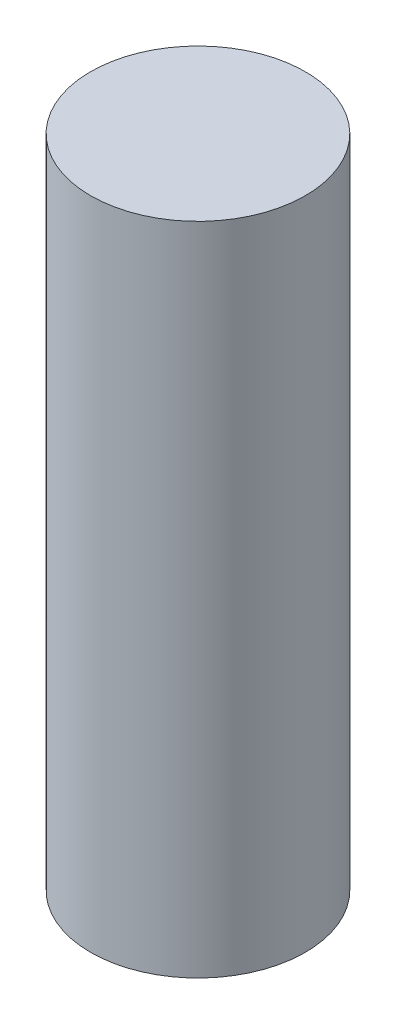
ISO-10303-21;
HEADER;
FILE_DESCRIPTION(('STEP AP214'),'2;1');
FILE_NAME('part.step','',(''),(''),'','','');
FILE_SCHEMA(('AUTOMOTIVE_DESIGN { 1 0 10303 214 1 1 1 1 }'));
ENDSEC;
DATA;
#1=APPLICATION_CONTEXT('core data for automotive mechanical design processes');
#2=APPLICATION_PROTOCOL_DEFINITION('international standard','automotive_design',2000,#1);
#3=PRODUCT_CONTEXT('',#1,'mechanical');
#4=PRODUCT('Part','Part','',(#3));
#5=PRODUCT_RELATED_PRODUCT_CATEGORY('part','',(#4));
#6=PRODUCT_DEFINITION_FORMATION('','',#4);
#7=PRODUCT_DEFINITION_CONTEXT('part definition',#1,'design');
#8=PRODUCT_DEFINITION('design','',#6,#7);
#9=PRODUCT_DEFINITION_SHAPE('','',#8);
#10=(LENGTH_UNIT() NAMED_UNIT(*) SI_UNIT(.MILLI.,.METRE.));
#11=(NAMED_UNIT(*) PLANE_ANGLE_UNIT() SI_UNIT($,.RADIAN.));
#12=(NAMED_UNIT(*) SI_UNIT($,.STERADIAN.) SOLID_ANGLE_UNIT());
#13=UNCERTAINTY_MEASURE_WITH_UNIT(LENGTH_MEASURE(1.E-05),#10,'distance_accuracy_value','');
#14=(GEOMETRIC_REPRESENTATION_CONTEXT(3) GLOBAL_UNCERTAINTY_ASSIGNED_CONTEXT((#13)) GLOBAL_UNIT_ASSIGNED_CONTEXT((#10,
#11,#12)) REPRESENTATION_CONTEXT('',''));
#15=CARTESIAN_POINT('',(0.,0.,0.));
#16=DIRECTION('',(0.,0.,1.));
#17=DIRECTION('',(1.,0.,0.));
#18=AXIS2_PLACEMENT_3D('',#15,#16,#17);
#19=CARTESIAN_POINT('',(0.,9.,0.));
#20=DIRECTION('',(0.,-1.,0.));
#21=DIRECTION('',(0.,0.,-1.));
#22=AXIS2_PLACEMENT_3D('',#19,#20,#21);
#23=CYLINDRICAL_SURFACE('',#22,2.95);
#24=CARTESIAN_POINT('',(0.,9.,0.));
#25=DIRECTION('',(0.,1.,0.));
#26=DIRECTION('',(0.,0.,1.));
#27=AXIS2_PLACEMENT_3D('',#24,#25,#26);
#28=CIRCLE('',#27,2.95);
#29=CARTESIAN_POINT('',(0.,9.,2.95));
#30=VERTEX_POINT('',#29);
#31=EDGE_CURVE('E10',#30,#30,#28,.T.);
#32=ORIENTED_EDGE('',*,*,#31,.F.);
#33=EDGE_LOOP('',(#32));
#34=FACE_BOUND('',#33,.T.);
#35=CARTESIAN_POINT('',(0.,-9.,0.));
#36=DIRECTION('',(0.,1.,0.));
#37=DIRECTION('',(0.,0.,1.));
#38=AXIS2_PLACEMENT_3D('',#35,#36,#37);
#39=CIRCLE('',#38,2.95);
#40=CARTESIAN_POINT('',(0.,-9.,2.95));
#41=VERTEX_POINT('',#40);
#42=EDGE_CURVE('E34',#41,#41,#39,.T.);
#43=ORIENTED_EDGE('',*,*,#42,.T.);
#44=EDGE_LOOP('',(#43));
#45=FACE_BOUND('',#44,.T.);
#46=ADVANCED_FACE('F31',(#34,#45),#23,.T.);
#47=CARTESIAN_POINT('',(0.,9.,0.));
#48=DIRECTION('',(0.,1.,0.));
#49=DIRECTION('',(0.,0.,1.));
#50=AXIS2_PLACEMENT_3D('',#47,#48,#49);
#51=PLANE('',#50);
#52=ORIENTED_EDGE('',*,*,#31,.T.);
#53=EDGE_LOOP('',(#52));
#54=FACE_BOUND('',#53,.T.);
#55=ADVANCED_FACE('F46',(#54),#51,.T.);
#56=CARTESIAN_POINT('',(0.,-9.,0.));
#57=DIRECTION('',(0.,1.,0.));
#58=DIRECTION('',(0.,0.,1.));
#59=AXIS2_PLACEMENT_3D('',#56,#57,#58);
#60=PLANE('',#59);
#61=ORIENTED_EDGE('',*,*,#42,.F.);
#62=EDGE_LOOP('',(#61));
#63=FACE_BOUND('',#62,.T.);
#64=ADVANCED_FACE('F44',(#63),#60,.F.);
#65=CLOSED_SHELL('',(#46,#55,#64));
#66=MANIFOLD_SOLID_BREP('B2',#65);
#67=ADVANCED_BREP_SHAPE_REPRESENTATION('',(#18,#66),#14);
#68=SHAPE_DEFINITION_REPRESENTATION(#9,#67);
ENDSEC;
END-ISO-10303-21;
